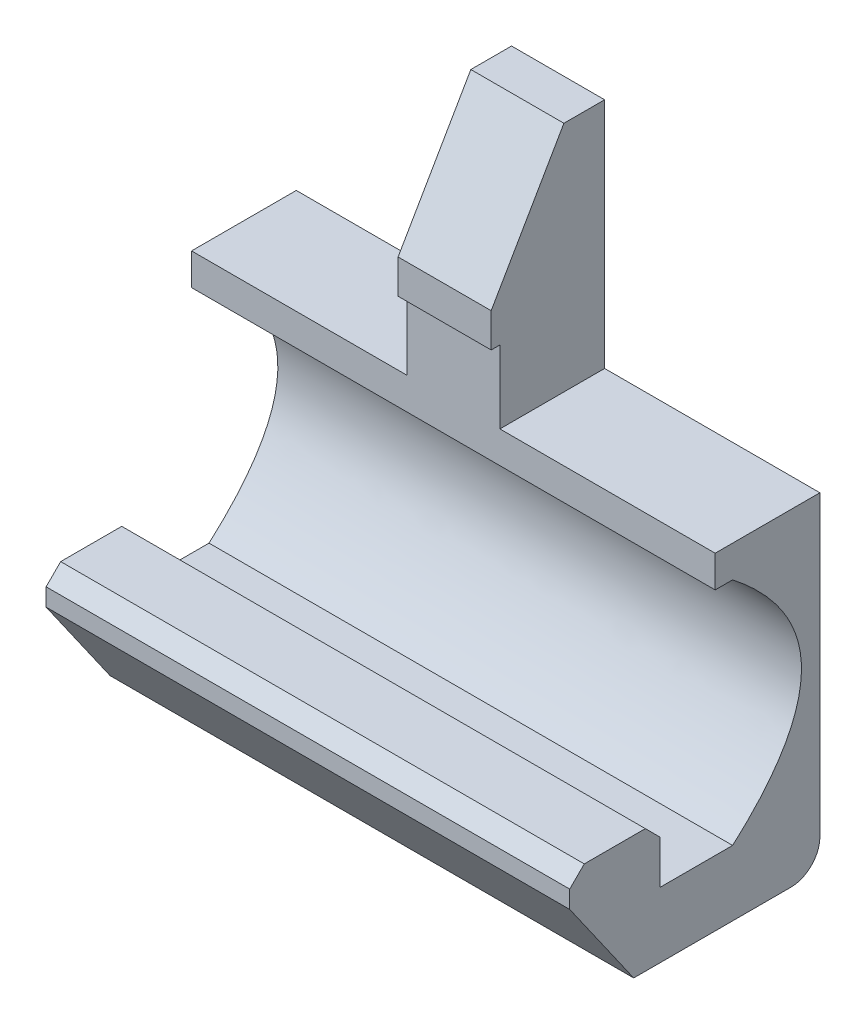
ISO-10303-21;
HEADER;
FILE_DESCRIPTION(('STEP AP214'),'2;1');
FILE_NAME('part.step','',(''),(''),'','','');
FILE_SCHEMA(('AUTOMOTIVE_DESIGN { 1 0 10303 214 1 1 1 1 }'));
ENDSEC;
DATA;
#1=APPLICATION_CONTEXT('core data for automotive mechanical design processes');
#2=APPLICATION_PROTOCOL_DEFINITION('international standard','automotive_design',2000,#1);
#3=PRODUCT_CONTEXT('',#1,'mechanical');
#4=PRODUCT('Part','Part','',(#3));
#5=PRODUCT_RELATED_PRODUCT_CATEGORY('part','',(#4));
#6=PRODUCT_DEFINITION_FORMATION('','',#4);
#7=PRODUCT_DEFINITION_CONTEXT('part definition',#1,'design');
#8=PRODUCT_DEFINITION('design','',#6,#7);
#9=PRODUCT_DEFINITION_SHAPE('','',#8);
#10=(LENGTH_UNIT() NAMED_UNIT(*) SI_UNIT(.MILLI.,.METRE.));
#11=(NAMED_UNIT(*) PLANE_ANGLE_UNIT() SI_UNIT($,.RADIAN.));
#12=(NAMED_UNIT(*) SI_UNIT($,.STERADIAN.) SOLID_ANGLE_UNIT());
#13=UNCERTAINTY_MEASURE_WITH_UNIT(LENGTH_MEASURE(1.E-05),#10,'distance_accuracy_value','');
#14=(GEOMETRIC_REPRESENTATION_CONTEXT(3) GLOBAL_UNCERTAINTY_ASSIGNED_CONTEXT((#13)) GLOBAL_UNIT_ASSIGNED_CONTEXT((#10,
#11,#12)) REPRESENTATION_CONTEXT('',''));
#15=CARTESIAN_POINT('',(0.,0.,0.));
#16=DIRECTION('',(0.,0.,1.));
#17=DIRECTION('',(1.,0.,0.));
#18=AXIS2_PLACEMENT_3D('',#15,#16,#17);
#19=CARTESIAN_POINT('',(0.,2.,0.));
#20=DIRECTION('',(0.,1.,0.));
#21=DIRECTION('',(0.,0.,1.));
#22=AXIS2_PLACEMENT_3D('',#19,#20,#21);
#23=PLANE('',#22);
#24=DIRECTION('',(0.,0.,-1.));
#25=VECTOR('',#24,1.);
#26=CARTESIAN_POINT('',(1.6,2.,-2.5));
#27=LINE('',#26,#25);
#28=CARTESIAN_POINT('',(1.6,2.,1.1));
#29=VERTEX_POINT('',#28);
#30=CARTESIAN_POINT('',(1.6,2.,-2.5));
#31=VERTEX_POINT('',#30);
#32=EDGE_CURVE('E349',#29,#31,#27,.T.);
#33=ORIENTED_EDGE('',*,*,#32,.F.);
#34=DIRECTION('',(-1.,0.,0.));
#35=VECTOR('',#34,1.);
#36=CARTESIAN_POINT('',(9.,2.,1.1));
#37=LINE('',#36,#35);
#38=CARTESIAN_POINT('',(9.,2.,1.1));
#39=VERTEX_POINT('',#38);
#40=EDGE_CURVE('E233',#39,#29,#37,.T.);
#41=ORIENTED_EDGE('',*,*,#40,.F.);
#42=DIRECTION('',(0.,0.,1.));
#43=VECTOR('',#42,1.);
#44=CARTESIAN_POINT('',(9.,2.,-2.5));
#45=LINE('',#44,#43);
#46=CARTESIAN_POINT('',(9.,2.,-2.5));
#47=VERTEX_POINT('',#46);
#48=EDGE_CURVE('E467',#47,#39,#45,.T.);
#49=ORIENTED_EDGE('',*,*,#48,.F.);
#50=DIRECTION('',(1.,0.,0.));
#51=VECTOR('',#50,1.);
#52=CARTESIAN_POINT('',(-9.,2.,-2.5));
#53=LINE('',#52,#51);
#54=EDGE_CURVE('E352',#31,#47,#53,.T.);
#55=ORIENTED_EDGE('',*,*,#54,.F.);
#56=EDGE_LOOP('',(#33,#41,#49,#55));
#57=FACE_BOUND('',#56,.T.);
#58=ADVANCED_FACE('F41',(#57),#23,.T.);
#59=CARTESIAN_POINT('',(-2.5,2.,-2.5));
#60=DIRECTION('',(0.,0.,1.));
#61=DIRECTION('',(1.,0.,0.));
#62=AXIS2_PLACEMENT_3D('',#59,#60,#61);
#63=PLANE('',#62);
#64=DIRECTION('',(0.,1.,0.));
#65=VECTOR('',#64,1.);
#66=CARTESIAN_POINT('',(9.,-11.,-2.5));
#67=LINE('',#66,#65);
#68=CARTESIAN_POINT('',(9.,-8.24700757976154,-2.5));
#69=VERTEX_POINT('',#68);
#70=EDGE_CURVE('E470',#69,#47,#67,.T.);
#71=ORIENTED_EDGE('',*,*,#70,.F.);
#72=DIRECTION('',(1.,0.,0.));
#73=VECTOR('',#72,1.);
#74=CARTESIAN_POINT('',(-2.5,-8.24700757976154,-2.5));
#75=LINE('',#74,#73);
#76=CARTESIAN_POINT('',(-9.,-8.24700757976154,-2.5));
#77=VERTEX_POINT('',#76);
#78=EDGE_CURVE('E50',#69,#77,#75,.F.);
#79=ORIENTED_EDGE('',*,*,#78,.T.);
#80=DIRECTION('',(0.,1.,0.));
#81=VECTOR('',#80,1.);
#82=CARTESIAN_POINT('',(-9.,-11.,-2.5));
#83=LINE('',#82,#81);
#84=CARTESIAN_POINT('',(-9.,2.,-2.5));
#85=VERTEX_POINT('',#84);
#86=EDGE_CURVE('E473',#77,#85,#83,.T.);
#87=ORIENTED_EDGE('',*,*,#86,.T.);
#88=CARTESIAN_POINT('',(-1.6,2.,-2.5));
#89=VERTEX_POINT('',#88);
#90=EDGE_CURVE('E463',#85,#89,#53,.T.);
#91=ORIENTED_EDGE('',*,*,#90,.T.);
#92=DIRECTION('',(0.,-1.,0.));
#93=VECTOR('',#92,1.);
#94=CARTESIAN_POINT('',(-1.6,7.,-2.5));
#95=LINE('',#94,#93);
#96=CARTESIAN_POINT('',(-1.6,10.,-2.5));
#97=VERTEX_POINT('',#96);
#98=EDGE_CURVE('E356',#97,#89,#95,.T.);
#99=ORIENTED_EDGE('',*,*,#98,.F.);
#100=DIRECTION('',(-1.,0.,0.));
#101=VECTOR('',#100,1.);
#102=CARTESIAN_POINT('',(-1.6,10.,-2.5));
#103=LINE('',#102,#101);
#104=CARTESIAN_POINT('',(1.6,10.,-2.5));
#105=VERTEX_POINT('',#104);
#106=EDGE_CURVE('E483',#105,#97,#103,.T.);
#107=ORIENTED_EDGE('',*,*,#106,.F.);
#108=DIRECTION('',(0.,-1.,0.));
#109=VECTOR('',#108,1.);
#110=CARTESIAN_POINT('',(1.6,7.,-2.5));
#111=LINE('',#110,#109);
#112=EDGE_CURVE('E491',#105,#31,#111,.T.);
#113=ORIENTED_EDGE('',*,*,#112,.T.);
#114=ORIENTED_EDGE('',*,*,#54,.T.);
#115=EDGE_LOOP('',(#71,#79,#87,#91,#99,#107,#113,#114));
#116=FACE_BOUND('',#115,.T.);
#117=ADVANCED_FACE('F306',(#116),#63,.F.);
#118=CARTESIAN_POINT('',(-1.6,7.,-2.5));
#119=DIRECTION('',(1.,0.,0.));
#120=DIRECTION('',(0.,0.,-1.));
#121=AXIS2_PLACEMENT_3D('',#118,#119,#120);
#122=PLANE('',#121);
#123=DIRECTION('',(0.,1.,0.));
#124=VECTOR('',#123,1.);
#125=CARTESIAN_POINT('',(-1.6,4.5,1.4));
#126=LINE('',#125,#124);
#127=CARTESIAN_POINT('',(-1.6,4.5,1.4));
#128=VERTEX_POINT('',#127);
#129=CARTESIAN_POINT('',(-1.6,5.66987298107781,1.4));
#130=VERTEX_POINT('',#129);
#131=EDGE_CURVE('E188',#128,#130,#126,.T.);
#132=ORIENTED_EDGE('',*,*,#131,.T.);
#133=DIRECTION('',(0.,-0.866025403784438,0.500000000000001));
#134=VECTOR('',#133,1.);
#135=CARTESIAN_POINT('',(-1.6,5.66987298107781,1.4));
#136=LINE('',#135,#134);
#137=CARTESIAN_POINT('',(-1.6,10.,-1.1));
#138=VERTEX_POINT('',#137);
#139=EDGE_CURVE('E499',#130,#138,#136,.F.);
#140=ORIENTED_EDGE('',*,*,#139,.T.);
#141=DIRECTION('',(0.,0.,1.));
#142=VECTOR('',#141,1.);
#143=CARTESIAN_POINT('',(-1.6,10.,-2.5));
#144=LINE('',#143,#142);
#145=EDGE_CURVE('E476',#97,#138,#144,.T.);
#146=ORIENTED_EDGE('',*,*,#145,.F.);
#147=ORIENTED_EDGE('',*,*,#98,.T.);
#148=DIRECTION('',(0.,0.,1.));
#149=VECTOR('',#148,1.);
#150=CARTESIAN_POINT('',(-1.6,2.,-2.5));
#151=LINE('',#150,#149);
#152=CARTESIAN_POINT('',(-1.6,2.,1.1));
#153=VERTEX_POINT('',#152);
#154=EDGE_CURVE('E357',#89,#153,#151,.T.);
#155=ORIENTED_EDGE('',*,*,#154,.T.);
#156=DIRECTION('',(0.,-1.,0.));
#157=VECTOR('',#156,1.);
#158=CARTESIAN_POINT('',(-1.6,7.,1.1));
#159=LINE('',#158,#157);
#160=CARTESIAN_POINT('',(-1.6,4.5,1.1));
#161=VERTEX_POINT('',#160);
#162=EDGE_CURVE('E190',#161,#153,#159,.T.);
#163=ORIENTED_EDGE('',*,*,#162,.F.);
#164=DIRECTION('',(0.,0.,1.));
#165=VECTOR('',#164,1.);
#166=CARTESIAN_POINT('',(-1.6,4.5,1.4));
#167=LINE('',#166,#165);
#168=EDGE_CURVE('E184',#161,#128,#167,.T.);
#169=ORIENTED_EDGE('',*,*,#168,.T.);
#170=EDGE_LOOP('',(#132,#140,#146,#147,#155,#163,#169));
#171=FACE_BOUND('',#170,.T.);
#172=ADVANCED_FACE('F186',(#171),#122,.F.);
#173=CARTESIAN_POINT('',(1.6,7.,-2.5));
#174=DIRECTION('',(-1.,0.,0.));
#175=DIRECTION('',(0.,0.,1.));
#176=AXIS2_PLACEMENT_3D('',#173,#174,#175);
#177=PLANE('',#176);
#178=DIRECTION('',(0.,0.,-1.));
#179=VECTOR('',#178,1.);
#180=CARTESIAN_POINT('',(1.6,10.,-2.5));
#181=LINE('',#180,#179);
#182=CARTESIAN_POINT('',(1.6,10.,-1.1));
#183=VERTEX_POINT('',#182);
#184=EDGE_CURVE('E480',#183,#105,#181,.T.);
#185=ORIENTED_EDGE('',*,*,#184,.F.);
#186=DIRECTION('',(0.,0.866025403784438,-0.500000000000001));
#187=VECTOR('',#186,1.);
#188=CARTESIAN_POINT('',(1.6,5.66987298107781,1.4));
#189=LINE('',#188,#187);
#190=CARTESIAN_POINT('',(1.6,5.66987298107781,1.4));
#191=VERTEX_POINT('',#190);
#192=EDGE_CURVE('E396',#183,#191,#189,.F.);
#193=ORIENTED_EDGE('',*,*,#192,.T.);
#194=DIRECTION('',(0.,-1.,0.));
#195=VECTOR('',#194,1.);
#196=CARTESIAN_POINT('',(1.6,4.5,1.4));
#197=LINE('',#196,#195);
#198=CARTESIAN_POINT('',(1.6,4.5,1.4));
#199=VERTEX_POINT('',#198);
#200=EDGE_CURVE('E216',#191,#199,#197,.T.);
#201=ORIENTED_EDGE('',*,*,#200,.T.);
#202=DIRECTION('',(0.,0.,-1.));
#203=VECTOR('',#202,1.);
#204=CARTESIAN_POINT('',(1.6,4.5,1.4));
#205=LINE('',#204,#203);
#206=CARTESIAN_POINT('',(1.6,4.5,1.1));
#207=VERTEX_POINT('',#206);
#208=EDGE_CURVE('E200',#199,#207,#205,.T.);
#209=ORIENTED_EDGE('',*,*,#208,.T.);
#210=DIRECTION('',(0.,1.,0.));
#211=VECTOR('',#210,1.);
#212=CARTESIAN_POINT('',(1.6,2.,1.1));
#213=LINE('',#212,#211);
#214=EDGE_CURVE('E237',#29,#207,#213,.T.);
#215=ORIENTED_EDGE('',*,*,#214,.F.);
#216=ORIENTED_EDGE('',*,*,#32,.T.);
#217=ORIENTED_EDGE('',*,*,#112,.F.);
#218=EDGE_LOOP('',(#185,#193,#201,#209,#215,#216,#217));
#219=FACE_BOUND('',#218,.T.);
#220=ADVANCED_FACE('F299',(#219),#177,.F.);
#221=CARTESIAN_POINT('',(0.,10.,0.));
#222=DIRECTION('',(0.,1.,0.));
#223=DIRECTION('',(0.,0.,1.));
#224=AXIS2_PLACEMENT_3D('',#221,#222,#223);
#225=PLANE('',#224);
#226=ORIENTED_EDGE('',*,*,#145,.T.);
#227=DIRECTION('',(1.,0.,0.));
#228=VECTOR('',#227,1.);
#229=CARTESIAN_POINT('',(0.,10.,-1.1));
#230=LINE('',#229,#228);
#231=EDGE_CURVE('E401',#138,#183,#230,.T.);
#232=ORIENTED_EDGE('',*,*,#231,.T.);
#233=ORIENTED_EDGE('',*,*,#184,.T.);
#234=ORIENTED_EDGE('',*,*,#106,.T.);
#235=EDGE_LOOP('',(#226,#232,#233,#234));
#236=FACE_BOUND('',#235,.T.);
#237=ADVANCED_FACE('F290',(#236),#225,.T.);
#238=DIRECTION('',(0.,0.,-1.));
#239=VECTOR('',#238,1.);
#240=CARTESIAN_POINT('',(-9.,2.,-2.5));
#241=LINE('',#240,#239);
#242=CARTESIAN_POINT('',(-9.,2.,1.1));
#243=VERTEX_POINT('',#242);
#244=EDGE_CURVE('E453',#243,#85,#241,.T.);
#245=ORIENTED_EDGE('',*,*,#244,.F.);
#246=DIRECTION('',(-1.,0.,0.));
#247=VECTOR('',#246,1.);
#248=CARTESIAN_POINT('',(-1.6,2.,1.1));
#249=LINE('',#248,#247);
#250=EDGE_CURVE('E219',#153,#243,#249,.T.);
#251=ORIENTED_EDGE('',*,*,#250,.F.);
#252=ORIENTED_EDGE('',*,*,#154,.F.);
#253=ORIENTED_EDGE('',*,*,#90,.F.);
#254=EDGE_LOOP('',(#245,#251,#252,#253));
#255=FACE_BOUND('',#254,.T.);
#256=ADVANCED_FACE('F286',(#255),#23,.T.);
#257=CARTESIAN_POINT('',(-9.,-11.,-2.5));
#258=DIRECTION('',(1.,0.,0.));
#259=DIRECTION('',(0.,0.,-1.));
#260=AXIS2_PLACEMENT_3D('',#257,#258,#259);
#261=PLANE('',#260);
#262=ORIENTED_EDGE('',*,*,#86,.F.);
#263=CARTESIAN_POINT('',(-9.,-8.24700757976154,-1.5));
#264=DIRECTION('',(1.,0.,0.));
#265=DIRECTION('',(0.,0.,-1.));
#266=AXIS2_PLACEMENT_3D('',#263,#264,#265);
#267=CIRCLE('',#266,1.);
#268=CARTESIAN_POINT('',(-9.,-9.24700757976154,-1.5));
#269=VERTEX_POINT('',#268);
#270=EDGE_CURVE('E11',#77,#269,#267,.F.);
#271=ORIENTED_EDGE('',*,*,#270,.T.);
#272=DIRECTION('',(0.,0.,1.));
#273=VECTOR('',#272,1.);
#274=CARTESIAN_POINT('',(-9.,-9.24700757976154,5.5));
#275=LINE('',#274,#273);
#276=CARTESIAN_POINT('',(-9.,-9.24700757976154,3.89999999999999));
#277=VERTEX_POINT('',#276);
#278=EDGE_CURVE('E210',#269,#277,#275,.T.);
#279=ORIENTED_EDGE('',*,*,#278,.T.);
#280=DIRECTION('',(0.,0.819152044288991,0.573576436351047));
#281=VECTOR('',#280,1.);
#282=CARTESIAN_POINT('',(-9.,-6.10508196492889,6.1));
#283=LINE('',#282,#281);
#284=CARTESIAN_POINT('',(-9.,-6.10508196492889,6.1));
#285=VERTEX_POINT('',#284);
#286=EDGE_CURVE('E385',#277,#285,#283,.T.);
#287=ORIENTED_EDGE('',*,*,#286,.T.);
#288=DIRECTION('',(0.,-1.,0.));
#289=VECTOR('',#288,1.);
#290=CARTESIAN_POINT('',(-9.,-5.,6.1));
#291=LINE('',#290,#289);
#292=CARTESIAN_POINT('',(-9.,-5.5,6.1));
#293=VERTEX_POINT('',#292);
#294=EDGE_CURVE('E372',#293,#285,#291,.T.);
#295=ORIENTED_EDGE('',*,*,#294,.F.);
#296=DIRECTION('',(0.,0.707106781186545,-0.70710678118655));
#297=VECTOR('',#296,1.);
#298=CARTESIAN_POINT('',(-9.,-5.5,6.1));
#299=LINE('',#298,#297);
#300=CARTESIAN_POINT('',(-9.,-5.,5.6));
#301=VERTEX_POINT('',#300);
#302=EDGE_CURVE('E422',#293,#301,#299,.T.);
#303=ORIENTED_EDGE('',*,*,#302,.T.);
#304=DIRECTION('',(0.,0.,-1.));
#305=VECTOR('',#304,1.);
#306=CARTESIAN_POINT('',(-9.,-5.,5.5));
#307=LINE('',#306,#305);
#308=CARTESIAN_POINT('',(-9.,-5.,3.5));
#309=VERTEX_POINT('',#308);
#310=EDGE_CURVE('E443',#301,#309,#307,.T.);
#311=ORIENTED_EDGE('',*,*,#310,.T.);
#312=DIRECTION('',(0.,0.707106781186545,0.70710678118655));
#313=VECTOR('',#312,1.);
#314=CARTESIAN_POINT('',(-9.,-5.5,3.));
#315=LINE('',#314,#313);
#316=CARTESIAN_POINT('',(-9.,-5.5,3.));
#317=VERTEX_POINT('',#316);
#318=EDGE_CURVE('E425',#309,#317,#315,.F.);
#319=ORIENTED_EDGE('',*,*,#318,.T.);
#320=DIRECTION('',(0.,-1.,0.));
#321=VECTOR('',#320,1.);
#322=CARTESIAN_POINT('',(-9.,-5.,3.));
#323=LINE('',#322,#321);
#324=CARTESIAN_POINT('',(-9.,-7.,3.));
#325=VERTEX_POINT('',#324);
#326=EDGE_CURVE('E527',#317,#325,#323,.T.);
#327=ORIENTED_EDGE('',*,*,#326,.T.);
#328=DIRECTION('',(0.,0.,-1.));
#329=VECTOR('',#328,1.);
#330=CARTESIAN_POINT('',(-9.,-7.,3.));
#331=LINE('',#330,#329);
#332=CARTESIAN_POINT('',(-9.,-7.,0.499999999999999));
#333=VERTEX_POINT('',#332);
#334=EDGE_CURVE('E456',#325,#333,#331,.T.);
#335=ORIENTED_EDGE('',*,*,#334,.T.);
#336=CARTESIAN_POINT('',(-9.,-7.,0.499999999999999));
#337=CARTESIAN_POINT('',(-9.,-2.8096589019456,-4.23299509662432));
#338=CARTESIAN_POINT('',(-9.,0.906362554516704,0.499999999999999));
#339=B_SPLINE_CURVE_WITH_KNOTS('',2,(#336,#337,#338),.UNSPECIFIED.,.F.,.F.,(3,3),(0.,1.),.UNSPECIFIED.);
#340=CARTESIAN_POINT('',(-9.,0.906362554516704,0.499999999999999));
#341=VERTEX_POINT('',#340);
#342=EDGE_CURVE('E251',#333,#341,#339,.T.);
#343=ORIENTED_EDGE('',*,*,#342,.T.);
#344=DIRECTION('',(0.,0.,-1.));
#345=VECTOR('',#344,1.);
#346=CARTESIAN_POINT('',(-9.,0.906362554516704,1.1));
#347=LINE('',#346,#345);
#348=CARTESIAN_POINT('',(-9.,0.906362554516704,1.1));
#349=VERTEX_POINT('',#348);
#350=EDGE_CURVE('E246',#349,#341,#347,.T.);
#351=ORIENTED_EDGE('',*,*,#350,.F.);
#352=DIRECTION('',(0.,-1.,0.));
#353=VECTOR('',#352,1.);
#354=CARTESIAN_POINT('',(-9.,2.,1.1));
#355=LINE('',#354,#353);
#356=EDGE_CURVE('E223',#243,#349,#355,.T.);
#357=ORIENTED_EDGE('',*,*,#356,.F.);
#358=ORIENTED_EDGE('',*,*,#244,.T.);
#359=EDGE_LOOP('',(#262,#271,#279,#287,#295,#303,#311,#319,#327,#335,#343,#351,#357,#358));
#360=FACE_BOUND('',#359,.T.);
#361=ADVANCED_FACE('F289',(#360),#261,.F.);
#362=CARTESIAN_POINT('',(9.,-11.,-2.5));
#363=DIRECTION('',(-1.,0.,0.));
#364=DIRECTION('',(0.,0.,1.));
#365=AXIS2_PLACEMENT_3D('',#362,#363,#364);
#366=PLANE('',#365);
#367=DIRECTION('',(0.,0.,1.));
#368=VECTOR('',#367,1.);
#369=CARTESIAN_POINT('',(9.,-9.24700757976154,5.5));
#370=LINE('',#369,#368);
#371=CARTESIAN_POINT('',(9.,-9.24700757976154,-1.5));
#372=VERTEX_POINT('',#371);
#373=CARTESIAN_POINT('',(9.,-9.24700757976154,3.89999999999999));
#374=VERTEX_POINT('',#373);
#375=EDGE_CURVE('E213',#372,#374,#370,.T.);
#376=ORIENTED_EDGE('',*,*,#375,.F.);
#377=CARTESIAN_POINT('',(9.,-8.24700757976154,-1.5));
#378=DIRECTION('',(-1.,0.,0.));
#379=DIRECTION('',(0.,0.,1.));
#380=AXIS2_PLACEMENT_3D('',#377,#378,#379);
#381=CIRCLE('',#380,1.);
#382=EDGE_CURVE('E64',#372,#69,#381,.F.);
#383=ORIENTED_EDGE('',*,*,#382,.T.);
#384=ORIENTED_EDGE('',*,*,#70,.T.);
#385=ORIENTED_EDGE('',*,*,#48,.T.);
#386=DIRECTION('',(0.,1.,0.));
#387=VECTOR('',#386,1.);
#388=CARTESIAN_POINT('',(9.,0.906362554516704,1.1));
#389=LINE('',#388,#387);
#390=CARTESIAN_POINT('',(9.,0.906362554516704,1.1));
#391=VERTEX_POINT('',#390);
#392=EDGE_CURVE('E229',#391,#39,#389,.T.);
#393=ORIENTED_EDGE('',*,*,#392,.F.);
#394=DIRECTION('',(0.,0.,-1.));
#395=VECTOR('',#394,1.);
#396=CARTESIAN_POINT('',(9.,0.906362554516704,1.1));
#397=LINE('',#396,#395);
#398=CARTESIAN_POINT('',(9.,0.906362554516704,0.5));
#399=VERTEX_POINT('',#398);
#400=EDGE_CURVE('E242',#391,#399,#397,.T.);
#401=ORIENTED_EDGE('',*,*,#400,.T.);
#402=CARTESIAN_POINT('',(9.,-7.,0.499999999999999));
#403=CARTESIAN_POINT('',(9.,-2.8096589019456,-4.23299509662432));
#404=CARTESIAN_POINT('',(9.,0.906362554516704,0.499999999999999));
#405=B_SPLINE_CURVE_WITH_KNOTS('',2,(#402,#403,#404),.UNSPECIFIED.,.F.,.F.,(3,3),(0.,1.),.UNSPECIFIED.);
#406=CARTESIAN_POINT('',(9.,-7.,0.499999999999999));
#407=VERTEX_POINT('',#406);
#408=EDGE_CURVE('E250',#407,#399,#405,.T.);
#409=ORIENTED_EDGE('',*,*,#408,.F.);
#410=DIRECTION('',(0.,0.,-1.));
#411=VECTOR('',#410,1.);
#412=CARTESIAN_POINT('',(9.,-7.,3.));
#413=LINE('',#412,#411);
#414=CARTESIAN_POINT('',(9.,-7.,3.));
#415=VERTEX_POINT('',#414);
#416=EDGE_CURVE('E520',#415,#407,#413,.T.);
#417=ORIENTED_EDGE('',*,*,#416,.F.);
#418=DIRECTION('',(0.,-1.,0.));
#419=VECTOR('',#418,1.);
#420=CARTESIAN_POINT('',(9.,-5.,3.));
#421=LINE('',#420,#419);
#422=CARTESIAN_POINT('',(9.,-5.5,3.));
#423=VERTEX_POINT('',#422);
#424=EDGE_CURVE('E528',#423,#415,#421,.T.);
#425=ORIENTED_EDGE('',*,*,#424,.F.);
#426=DIRECTION('',(0.,-0.707106781186545,-0.70710678118655));
#427=VECTOR('',#426,1.);
#428=CARTESIAN_POINT('',(9.,-5.5,3.));
#429=LINE('',#428,#427);
#430=CARTESIAN_POINT('',(9.,-5.,3.5));
#431=VERTEX_POINT('',#430);
#432=EDGE_CURVE('E413',#423,#431,#429,.F.);
#433=ORIENTED_EDGE('',*,*,#432,.T.);
#434=DIRECTION('',(0.,0.,-1.));
#435=VECTOR('',#434,1.);
#436=CARTESIAN_POINT('',(9.,-5.,5.5));
#437=LINE('',#436,#435);
#438=CARTESIAN_POINT('',(9.,-5.,5.6));
#439=VERTEX_POINT('',#438);
#440=EDGE_CURVE('E448',#439,#431,#437,.T.);
#441=ORIENTED_EDGE('',*,*,#440,.F.);
#442=DIRECTION('',(0.,-0.707106781186545,0.70710678118655));
#443=VECTOR('',#442,1.);
#444=CARTESIAN_POINT('',(9.,-5.5,6.1));
#445=LINE('',#444,#443);
#446=CARTESIAN_POINT('',(9.,-5.5,6.1));
#447=VERTEX_POINT('',#446);
#448=EDGE_CURVE('E410',#439,#447,#445,.T.);
#449=ORIENTED_EDGE('',*,*,#448,.T.);
#450=DIRECTION('',(0.,1.,0.));
#451=VECTOR('',#450,1.);
#452=CARTESIAN_POINT('',(9.,-9.24700757976154,6.1));
#453=LINE('',#452,#451);
#454=CARTESIAN_POINT('',(9.,-6.10508196492889,6.1));
#455=VERTEX_POINT('',#454);
#456=EDGE_CURVE('E367',#455,#447,#453,.T.);
#457=ORIENTED_EDGE('',*,*,#456,.F.);
#458=DIRECTION('',(0.,-0.819152044288991,-0.573576436351047));
#459=VECTOR('',#458,1.);
#460=CARTESIAN_POINT('',(9.,-6.10508196492889,6.1));
#461=LINE('',#460,#459);
#462=EDGE_CURVE('E394',#455,#374,#461,.T.);
#463=ORIENTED_EDGE('',*,*,#462,.T.);
#464=EDGE_LOOP('',(#376,#383,#384,#385,#393,#401,#409,#417,#425,#433,#441,#449,#457,#463));
#465=FACE_BOUND('',#464,.T.);
#466=ADVANCED_FACE('F284',(#465),#366,.F.);
#467=CARTESIAN_POINT('',(-9.,-5.,5.5));
#468=DIRECTION('',(0.,-1.,0.));
#469=DIRECTION('',(0.,0.,-1.));
#470=AXIS2_PLACEMENT_3D('',#467,#468,#469);
#471=PLANE('',#470);
#472=ORIENTED_EDGE('',*,*,#440,.T.);
#473=DIRECTION('',(-1.,0.,0.));
#474=VECTOR('',#473,1.);
#475=CARTESIAN_POINT('',(-9.,-5.,3.5));
#476=LINE('',#475,#474);
#477=EDGE_CURVE('E419',#431,#309,#476,.T.);
#478=ORIENTED_EDGE('',*,*,#477,.T.);
#479=ORIENTED_EDGE('',*,*,#310,.F.);
#480=DIRECTION('',(1.,0.,0.));
#481=VECTOR('',#480,1.);
#482=CARTESIAN_POINT('',(9.,-5.,5.6));
#483=LINE('',#482,#481);
#484=EDGE_CURVE('E416',#301,#439,#483,.T.);
#485=ORIENTED_EDGE('',*,*,#484,.T.);
#486=EDGE_LOOP('',(#472,#478,#479,#485));
#487=FACE_BOUND('',#486,.T.);
#488=ADVANCED_FACE('F280',(#487),#471,.F.);
#489=CARTESIAN_POINT('',(-9.,-5.,3.));
#490=DIRECTION('',(0.,0.,1.));
#491=DIRECTION('',(0.,-1.,0.));
#492=AXIS2_PLACEMENT_3D('',#489,#490,#491);
#493=PLANE('',#492);
#494=ORIENTED_EDGE('',*,*,#326,.F.);
#495=DIRECTION('',(1.,0.,0.));
#496=VECTOR('',#495,1.);
#497=CARTESIAN_POINT('',(-9.,-5.5,3.));
#498=LINE('',#497,#496);
#499=EDGE_CURVE('E390',#317,#423,#498,.T.);
#500=ORIENTED_EDGE('',*,*,#499,.T.);
#501=ORIENTED_EDGE('',*,*,#424,.T.);
#502=DIRECTION('',(1.,0.,0.));
#503=VECTOR('',#502,1.);
#504=CARTESIAN_POINT('',(-9.,-7.,3.));
#505=LINE('',#504,#503);
#506=EDGE_CURVE('E449',#325,#415,#505,.T.);
#507=ORIENTED_EDGE('',*,*,#506,.F.);
#508=EDGE_LOOP('',(#494,#500,#501,#507));
#509=FACE_BOUND('',#508,.T.);
#510=ADVANCED_FACE('F276',(#509),#493,.F.);
#511=CARTESIAN_POINT('',(-9.,-7.,3.));
#512=DIRECTION('',(0.,-1.,0.));
#513=DIRECTION('',(0.,0.,-1.));
#514=AXIS2_PLACEMENT_3D('',#511,#512,#513);
#515=PLANE('',#514);
#516=ORIENTED_EDGE('',*,*,#416,.T.);
#517=DIRECTION('',(1.,0.,0.));
#518=VECTOR('',#517,1.);
#519=CARTESIAN_POINT('',(-9.,-7.,0.499999999999999));
#520=LINE('',#519,#518);
#521=EDGE_CURVE('E524',#333,#407,#520,.T.);
#522=ORIENTED_EDGE('',*,*,#521,.F.);
#523=ORIENTED_EDGE('',*,*,#334,.F.);
#524=ORIENTED_EDGE('',*,*,#506,.T.);
#525=EDGE_LOOP('',(#516,#522,#523,#524));
#526=FACE_BOUND('',#525,.T.);
#527=ADVANCED_FACE('F271',(#526),#515,.F.);
#528=DIRECTION('',(1.,0.,0.));
#529=VECTOR('',#528,1.);
#530=SURFACE_OF_LINEAR_EXTRUSION('',#339,#529);
#531=ORIENTED_EDGE('',*,*,#408,.T.);
#532=DIRECTION('',(1.,0.,0.));
#533=VECTOR('',#532,1.);
#534=CARTESIAN_POINT('',(-9.,0.906362554516704,0.499999999999999));
#535=LINE('',#534,#533);
#536=EDGE_CURVE('E258',#341,#399,#535,.T.);
#537=ORIENTED_EDGE('',*,*,#536,.F.);
#538=ORIENTED_EDGE('',*,*,#342,.F.);
#539=ORIENTED_EDGE('',*,*,#521,.T.);
#540=EDGE_LOOP('',(#531,#537,#538,#539));
#541=FACE_BOUND('',#540,.T.);
#542=ADVANCED_FACE('F266',(#541),#530,.F.);
#543=CARTESIAN_POINT('',(-9.,0.906362554516704,1.1));
#544=DIRECTION('',(0.,1.,0.));
#545=DIRECTION('',(0.,0.,1.));
#546=AXIS2_PLACEMENT_3D('',#543,#544,#545);
#547=PLANE('',#546);
#548=ORIENTED_EDGE('',*,*,#536,.T.);
#549=ORIENTED_EDGE('',*,*,#400,.F.);
#550=DIRECTION('',(1.,0.,0.));
#551=VECTOR('',#550,1.);
#552=CARTESIAN_POINT('',(-9.,0.906362554516704,1.1));
#553=LINE('',#552,#551);
#554=EDGE_CURVE('E226',#349,#391,#553,.T.);
#555=ORIENTED_EDGE('',*,*,#554,.F.);
#556=ORIENTED_EDGE('',*,*,#350,.T.);
#557=EDGE_LOOP('',(#548,#549,#555,#556));
#558=FACE_BOUND('',#557,.T.);
#559=ADVANCED_FACE('F270',(#558),#547,.F.);
#560=CARTESIAN_POINT('',(0.,0.,1.1));
#561=DIRECTION('',(0.,0.,1.));
#562=DIRECTION('',(1.,0.,0.));
#563=AXIS2_PLACEMENT_3D('',#560,#561,#562);
#564=PLANE('',#563);
#565=DIRECTION('',(1.,0.,0.));
#566=VECTOR('',#565,1.);
#567=CARTESIAN_POINT('',(0.,4.5,1.1));
#568=LINE('',#567,#566);
#569=EDGE_CURVE('E494',#161,#207,#568,.T.);
#570=ORIENTED_EDGE('',*,*,#569,.F.);
#571=ORIENTED_EDGE('',*,*,#162,.T.);
#572=ORIENTED_EDGE('',*,*,#250,.T.);
#573=ORIENTED_EDGE('',*,*,#356,.T.);
#574=ORIENTED_EDGE('',*,*,#554,.T.);
#575=ORIENTED_EDGE('',*,*,#392,.T.);
#576=ORIENTED_EDGE('',*,*,#40,.T.);
#577=ORIENTED_EDGE('',*,*,#214,.T.);
#578=EDGE_LOOP('',(#570,#571,#572,#573,#574,#575,#576,#577));
#579=FACE_BOUND('',#578,.T.);
#580=ADVANCED_FACE('F360',(#579),#564,.T.);
#581=CARTESIAN_POINT('',(8.34240313241503,4.5,1.4));
#582=DIRECTION('',(0.,0.,1.));
#583=DIRECTION('',(1.,0.,0.));
#584=AXIS2_PLACEMENT_3D('',#581,#582,#583);
#585=PLANE('',#584);
#586=ORIENTED_EDGE('',*,*,#200,.F.);
#587=DIRECTION('',(-1.,0.,0.));
#588=VECTOR('',#587,1.);
#589=CARTESIAN_POINT('',(8.34240313241503,5.66987298107781,1.4));
#590=LINE('',#589,#588);
#591=EDGE_CURVE('E208',#191,#130,#590,.T.);
#592=ORIENTED_EDGE('',*,*,#591,.T.);
#593=ORIENTED_EDGE('',*,*,#131,.F.);
#594=DIRECTION('',(-1.,0.,0.));
#595=VECTOR('',#594,1.);
#596=CARTESIAN_POINT('',(8.34240313241503,4.5,1.4));
#597=LINE('',#596,#595);
#598=EDGE_CURVE('E194',#199,#128,#597,.T.);
#599=ORIENTED_EDGE('',*,*,#598,.F.);
#600=EDGE_LOOP('',(#586,#592,#593,#599));
#601=FACE_BOUND('',#600,.T.);
#602=ADVANCED_FACE('F206',(#601),#585,.T.);
#603=CARTESIAN_POINT('',(8.34240313241503,4.5,1.4));
#604=DIRECTION('',(0.,-1.,0.));
#605=DIRECTION('',(0.,0.,-1.));
#606=AXIS2_PLACEMENT_3D('',#603,#604,#605);
#607=PLANE('',#606);
#608=ORIENTED_EDGE('',*,*,#168,.F.);
#609=ORIENTED_EDGE('',*,*,#569,.T.);
#610=ORIENTED_EDGE('',*,*,#208,.F.);
#611=ORIENTED_EDGE('',*,*,#598,.T.);
#612=EDGE_LOOP('',(#608,#609,#610,#611));
#613=FACE_BOUND('',#612,.T.);
#614=ADVANCED_FACE('F198',(#613),#607,.T.);
#615=CARTESIAN_POINT('',(8.34240313241503,5.66987298107781,1.4));
#616=DIRECTION('',(0.,-0.500000000000001,-0.866025403784438));
#617=DIRECTION('',(-1.,0.,0.));
#618=AXIS2_PLACEMENT_3D('',#615,#616,#617);
#619=PLANE('',#618);
#620=ORIENTED_EDGE('',*,*,#192,.F.);
#621=ORIENTED_EDGE('',*,*,#231,.F.);
#622=ORIENTED_EDGE('',*,*,#139,.F.);
#623=ORIENTED_EDGE('',*,*,#591,.F.);
#624=EDGE_LOOP('',(#620,#621,#622,#623));
#625=FACE_BOUND('',#624,.T.);
#626=ADVANCED_FACE('F310',(#625),#619,.F.);
#627=CARTESIAN_POINT('',(-9.,-9.24700757976154,5.5));
#628=DIRECTION('',(0.,1.,0.));
#629=DIRECTION('',(0.,0.,1.));
#630=AXIS2_PLACEMENT_3D('',#627,#628,#629);
#631=PLANE('',#630);
#632=ORIENTED_EDGE('',*,*,#278,.F.);
#633=DIRECTION('',(1.,0.,0.));
#634=VECTOR('',#633,1.);
#635=CARTESIAN_POINT('',(-9.,-9.24700757976154,-1.5));
#636=LINE('',#635,#634);
#637=EDGE_CURVE('E430',#269,#372,#636,.T.);
#638=ORIENTED_EDGE('',*,*,#637,.T.);
#639=ORIENTED_EDGE('',*,*,#375,.T.);
#640=DIRECTION('',(-1.,0.,0.));
#641=VECTOR('',#640,1.);
#642=CARTESIAN_POINT('',(-9.,-9.24700757976154,3.89999999999999));
#643=LINE('',#642,#641);
#644=EDGE_CURVE('E391',#374,#277,#643,.T.);
#645=ORIENTED_EDGE('',*,*,#644,.T.);
#646=EDGE_LOOP('',(#632,#638,#639,#645));
#647=FACE_BOUND('',#646,.T.);
#648=ADVANCED_FACE('F316',(#647),#631,.F.);
#649=CARTESIAN_POINT('',(0.,0.,6.1));
#650=DIRECTION('',(0.,0.,1.));
#651=DIRECTION('',(1.,0.,0.));
#652=AXIS2_PLACEMENT_3D('',#649,#650,#651);
#653=PLANE('',#652);
#654=ORIENTED_EDGE('',*,*,#456,.T.);
#655=DIRECTION('',(-1.,0.,0.));
#656=VECTOR('',#655,1.);
#657=CARTESIAN_POINT('',(-9.,-5.5,6.1));
#658=LINE('',#657,#656);
#659=EDGE_CURVE('E383',#447,#293,#658,.T.);
#660=ORIENTED_EDGE('',*,*,#659,.T.);
#661=ORIENTED_EDGE('',*,*,#294,.T.);
#662=DIRECTION('',(1.,0.,0.));
#663=VECTOR('',#662,1.);
#664=CARTESIAN_POINT('',(9.,-6.10508196492889,6.1));
#665=LINE('',#664,#663);
#666=EDGE_CURVE('E380',#285,#455,#665,.T.);
#667=ORIENTED_EDGE('',*,*,#666,.T.);
#668=EDGE_LOOP('',(#654,#660,#661,#667));
#669=FACE_BOUND('',#668,.T.);
#670=ADVANCED_FACE('F325',(#669),#653,.T.);
#671=CARTESIAN_POINT('',(0.,-6.10508196492889,6.1));
#672=DIRECTION('',(0.,-0.573576436351047,0.819152044288991));
#673=DIRECTION('',(-1.,0.,0.));
#674=AXIS2_PLACEMENT_3D('',#671,#672,#673);
#675=PLANE('',#674);
#676=ORIENTED_EDGE('',*,*,#286,.F.);
#677=ORIENTED_EDGE('',*,*,#644,.F.);
#678=ORIENTED_EDGE('',*,*,#462,.F.);
#679=ORIENTED_EDGE('',*,*,#666,.F.);
#680=EDGE_LOOP('',(#676,#677,#678,#679));
#681=FACE_BOUND('',#680,.T.);
#682=ADVANCED_FACE('F318',(#681),#675,.T.);
#683=CARTESIAN_POINT('',(-9.,-5.5,3.));
#684=DIRECTION('',(0.,-0.70710678118655,0.707106781186545));
#685=DIRECTION('',(1.,0.,0.));
#686=AXIS2_PLACEMENT_3D('',#683,#684,#685);
#687=PLANE('',#686);
#688=ORIENTED_EDGE('',*,*,#318,.F.);
#689=ORIENTED_EDGE('',*,*,#477,.F.);
#690=ORIENTED_EDGE('',*,*,#432,.F.);
#691=ORIENTED_EDGE('',*,*,#499,.F.);
#692=EDGE_LOOP('',(#688,#689,#690,#691));
#693=FACE_BOUND('',#692,.T.);
#694=ADVANCED_FACE('F324',(#693),#687,.F.);
#695=CARTESIAN_POINT('',(0.,-5.5,6.1));
#696=DIRECTION('',(0.,0.70710678118655,0.707106781186545));
#697=DIRECTION('',(1.,0.,0.));
#698=AXIS2_PLACEMENT_3D('',#695,#696,#697);
#699=PLANE('',#698);
#700=ORIENTED_EDGE('',*,*,#448,.F.);
#701=ORIENTED_EDGE('',*,*,#484,.F.);
#702=ORIENTED_EDGE('',*,*,#302,.F.);
#703=ORIENTED_EDGE('',*,*,#659,.F.);
#704=EDGE_LOOP('',(#700,#701,#702,#703));
#705=FACE_BOUND('',#704,.T.);
#706=ADVANCED_FACE('F331',(#705),#699,.T.);
#707=CARTESIAN_POINT('',(-9.,-8.24700757976154,-1.5));
#708=DIRECTION('',(1.,0.,0.));
#709=DIRECTION('',(0.,0.,-1.));
#710=AXIS2_PLACEMENT_3D('',#707,#708,#709);
#711=CYLINDRICAL_SURFACE('',#710,1.);
#712=ORIENTED_EDGE('',*,*,#270,.F.);
#713=ORIENTED_EDGE('',*,*,#78,.F.);
#714=ORIENTED_EDGE('',*,*,#382,.F.);
#715=ORIENTED_EDGE('',*,*,#637,.F.);
#716=EDGE_LOOP('',(#712,#713,#714,#715));
#717=FACE_BOUND('',#716,.T.);
#718=ADVANCED_FACE('F43',(#717),#711,.T.);
#719=CLOSED_SHELL('',(#58,#117,#172,#220,#237,#256,#361,#466,#488,#510,#527,#542,#559,#580,#602,
#614,#626,#648,#670,#682,#694,#706,#718));
#720=MANIFOLD_SOLID_BREP('B2',#719);
#721=ADVANCED_BREP_SHAPE_REPRESENTATION('',(#18,#720),#14);
#722=SHAPE_DEFINITION_REPRESENTATION(#9,#721);
ENDSEC;
END-ISO-10303-21;
